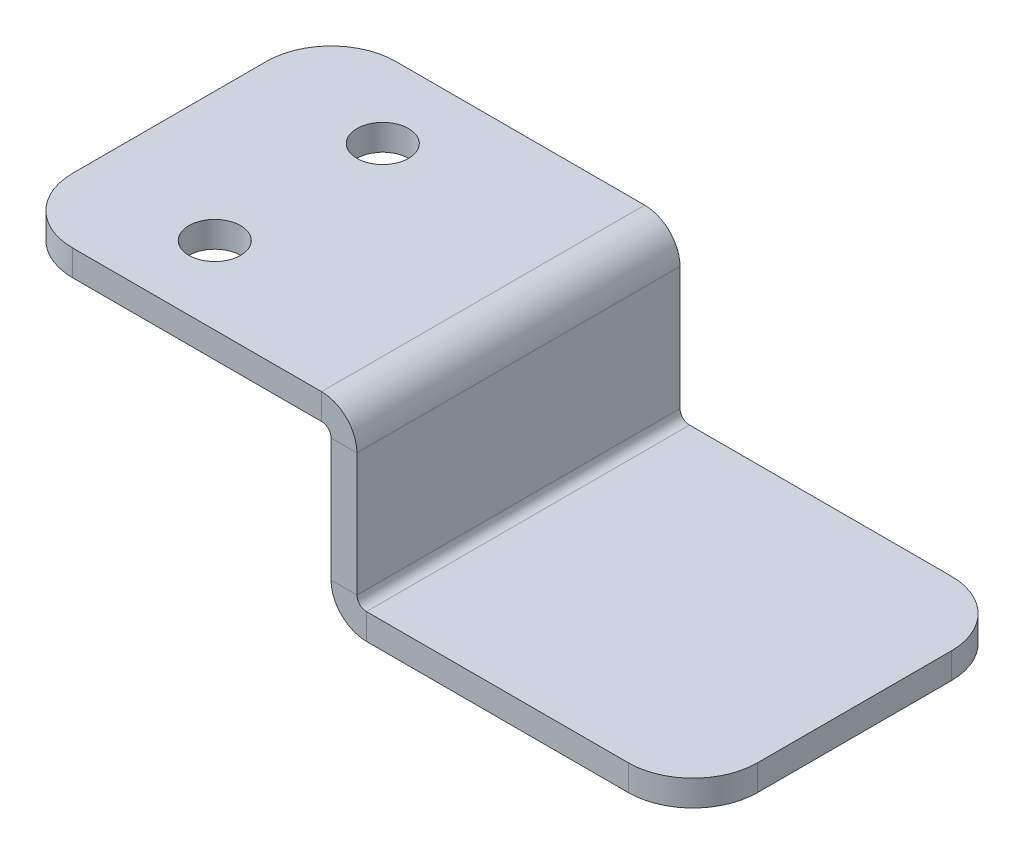
ISO-10303-21;
HEADER;
FILE_DESCRIPTION(('STEP AP214'),'2;1');
FILE_NAME('part.step','',(''),(''),'','','');
FILE_SCHEMA(('AUTOMOTIVE_DESIGN { 1 0 10303 214 1 1 1 1 }'));
ENDSEC;
DATA;
#1=APPLICATION_CONTEXT('core data for automotive mechanical design processes');
#2=APPLICATION_PROTOCOL_DEFINITION('international standard','automotive_design',2000,#1);
#3=PRODUCT_CONTEXT('',#1,'mechanical');
#4=PRODUCT('Part','Part','',(#3));
#5=PRODUCT_RELATED_PRODUCT_CATEGORY('part','',(#4));
#6=PRODUCT_DEFINITION_FORMATION('','',#4);
#7=PRODUCT_DEFINITION_CONTEXT('part definition',#1,'design');
#8=PRODUCT_DEFINITION('design','',#6,#7);
#9=PRODUCT_DEFINITION_SHAPE('','',#8);
#10=(LENGTH_UNIT() NAMED_UNIT(*) SI_UNIT(.MILLI.,.METRE.));
#11=(NAMED_UNIT(*) PLANE_ANGLE_UNIT() SI_UNIT($,.RADIAN.));
#12=(NAMED_UNIT(*) SI_UNIT($,.STERADIAN.) SOLID_ANGLE_UNIT());
#13=UNCERTAINTY_MEASURE_WITH_UNIT(LENGTH_MEASURE(1.E-05),#10,'distance_accuracy_value','');
#14=(GEOMETRIC_REPRESENTATION_CONTEXT(3) GLOBAL_UNCERTAINTY_ASSIGNED_CONTEXT((#13)) GLOBAL_UNIT_ASSIGNED_CONTEXT((#10,
#11,#12)) REPRESENTATION_CONTEXT('',''));
#15=CARTESIAN_POINT('',(0.,0.,0.));
#16=DIRECTION('',(0.,0.,1.));
#17=DIRECTION('',(1.,0.,0.));
#18=AXIS2_PLACEMENT_3D('',#15,#16,#17);
#19=CARTESIAN_POINT('',(25.,-10.2634,12.5));
#20=DIRECTION('',(0.,0.,1.));
#21=DIRECTION('',(1.,0.,0.));
#22=AXIS2_PLACEMENT_3D('',#19,#20,#21);
#23=PLANE('',#22);
#24=DIRECTION('',(1.,0.,0.));
#25=VECTOR('',#24,1.);
#26=CARTESIAN_POINT('',(25.,-10.2634,12.5));
#27=LINE('',#26,#25);
#28=CARTESIAN_POINT('',(25.,-10.2634,12.5));
#29=VERTEX_POINT('',#28);
#30=CARTESIAN_POINT('',(27.,-10.2634,12.5));
#31=VERTEX_POINT('',#30);
#32=EDGE_CURVE('E273',#29,#31,#27,.T.);
#33=ORIENTED_EDGE('',*,*,#32,.F.);
#34=CARTESIAN_POINT('',(27.7366,-10.2634,12.5));
#35=DIRECTION('',(0.,0.,1.));
#36=DIRECTION('',(1.,0.,0.));
#37=AXIS2_PLACEMENT_3D('',#34,#35,#36);
#38=CIRCLE('',#37,2.7366);
#39=CARTESIAN_POINT('',(27.7366,-13.,12.5));
#40=VERTEX_POINT('',#39);
#41=EDGE_CURVE('E191',#40,#29,#38,.F.);
#42=ORIENTED_EDGE('',*,*,#41,.F.);
#43=DIRECTION('',(0.,-1.,0.));
#44=VECTOR('',#43,1.);
#45=CARTESIAN_POINT('',(27.7366,-11.,12.5));
#46=LINE('',#45,#44);
#47=CARTESIAN_POINT('',(27.7366,-11.,12.5));
#48=VERTEX_POINT('',#47);
#49=EDGE_CURVE('E270',#48,#40,#46,.T.);
#50=ORIENTED_EDGE('',*,*,#49,.F.);
#51=CARTESIAN_POINT('',(27.7366,-10.2634,12.5));
#52=DIRECTION('',(0.,0.,1.));
#53=DIRECTION('',(1.,0.,0.));
#54=AXIS2_PLACEMENT_3D('',#51,#52,#53);
#55=CIRCLE('',#54,0.7366);
#56=EDGE_CURVE('E201',#48,#31,#55,.F.);
#57=ORIENTED_EDGE('',*,*,#56,.T.);
#58=EDGE_LOOP('',(#33,#42,#50,#57));
#59=FACE_BOUND('',#58,.T.);
#60=ADVANCED_FACE('F39',(#59),#23,.T.);
#61=CARTESIAN_POINT('',(27.7366,-11.,12.5));
#62=DIRECTION('',(0.,0.,1.));
#63=DIRECTION('',(1.,0.,0.));
#64=AXIS2_PLACEMENT_3D('',#61,#62,#63);
#65=PLANE('',#64);
#66=DIRECTION('',(0.,1.,0.));
#67=VECTOR('',#66,1.);
#68=CARTESIAN_POINT('',(25.,-13.,12.5));
#69=LINE('',#68,#67);
#70=CARTESIAN_POINT('',(25.,-0.736600000000007,12.5));
#71=VERTEX_POINT('',#70);
#72=EDGE_CURVE('E189',#29,#71,#69,.T.);
#73=ORIENTED_EDGE('',*,*,#72,.F.);
#74=ORIENTED_EDGE('',*,*,#32,.T.);
#75=DIRECTION('',(0.,1.,0.));
#76=VECTOR('',#75,1.);
#77=CARTESIAN_POINT('',(27.,-13.,12.5));
#78=LINE('',#77,#76);
#79=CARTESIAN_POINT('',(27.,-0.736600000000026,12.5));
#80=VERTEX_POINT('',#79);
#81=EDGE_CURVE('E204',#31,#80,#78,.T.);
#82=ORIENTED_EDGE('',*,*,#81,.T.);
#83=DIRECTION('',(-1.,0.,0.));
#84=VECTOR('',#83,1.);
#85=CARTESIAN_POINT('',(27.,-0.736600000000026,12.5));
#86=LINE('',#85,#84);
#87=EDGE_CURVE('E166',#80,#71,#86,.T.);
#88=ORIENTED_EDGE('',*,*,#87,.T.);
#89=EDGE_LOOP('',(#73,#74,#82,#88));
#90=FACE_BOUND('',#89,.T.);
#91=ADVANCED_FACE('F352',(#90),#65,.T.);
#92=CARTESIAN_POINT('',(27.7366,-13.,-12.5));
#93=DIRECTION('',(0.,0.,-1.));
#94=DIRECTION('',(-1.,0.,0.));
#95=AXIS2_PLACEMENT_3D('',#92,#93,#94);
#96=PLANE('',#95);
#97=DIRECTION('',(0.,1.,0.));
#98=VECTOR('',#97,1.);
#99=CARTESIAN_POINT('',(27.7366,-13.,-12.5));
#100=LINE('',#99,#98);
#101=CARTESIAN_POINT('',(27.7366,-13.,-12.5));
#102=VERTEX_POINT('',#101);
#103=CARTESIAN_POINT('',(27.7366,-11.,-12.5));
#104=VERTEX_POINT('',#103);
#105=EDGE_CURVE('E267',#102,#104,#100,.T.);
#106=ORIENTED_EDGE('',*,*,#105,.F.);
#107=CARTESIAN_POINT('',(27.7366,-10.2634,-12.5));
#108=DIRECTION('',(0.,0.,1.));
#109=DIRECTION('',(1.,0.,0.));
#110=AXIS2_PLACEMENT_3D('',#107,#108,#109);
#111=CIRCLE('',#110,2.7366);
#112=CARTESIAN_POINT('',(25.,-10.2634,-12.5));
#113=VERTEX_POINT('',#112);
#114=EDGE_CURVE('E218',#102,#113,#111,.F.);
#115=ORIENTED_EDGE('',*,*,#114,.T.);
#116=DIRECTION('',(-1.,0.,0.));
#117=VECTOR('',#116,1.);
#118=CARTESIAN_POINT('',(27.,-10.2634,-12.5));
#119=LINE('',#118,#117);
#120=CARTESIAN_POINT('',(27.,-10.2634,-12.5));
#121=VERTEX_POINT('',#120);
#122=EDGE_CURVE('E165',#121,#113,#119,.T.);
#123=ORIENTED_EDGE('',*,*,#122,.F.);
#124=CARTESIAN_POINT('',(27.7366,-10.2634,-12.5));
#125=DIRECTION('',(0.,0.,1.));
#126=DIRECTION('',(1.,0.,0.));
#127=AXIS2_PLACEMENT_3D('',#124,#125,#126);
#128=CIRCLE('',#127,0.7366);
#129=EDGE_CURVE('E225',#104,#121,#128,.F.);
#130=ORIENTED_EDGE('',*,*,#129,.F.);
#131=EDGE_LOOP('',(#106,#115,#123,#130));
#132=FACE_BOUND('',#131,.T.);
#133=ADVANCED_FACE('F367',(#132),#96,.T.);
#134=CARTESIAN_POINT('',(27.,-10.2634,-12.5));
#135=DIRECTION('',(0.,0.,-1.));
#136=DIRECTION('',(-1.,0.,0.));
#137=AXIS2_PLACEMENT_3D('',#134,#135,#136);
#138=PLANE('',#137);
#139=DIRECTION('',(-1.,0.,0.));
#140=VECTOR('',#139,1.);
#141=CARTESIAN_POINT('',(53.,-11.,-12.5));
#142=LINE('',#141,#140);
#143=CARTESIAN_POINT('',(48.,-11.,-12.5));
#144=VERTEX_POINT('',#143);
#145=EDGE_CURVE('E223',#144,#104,#142,.T.);
#146=ORIENTED_EDGE('',*,*,#145,.F.);
#147=DIRECTION('',(0.,-1.,0.));
#148=VECTOR('',#147,1.);
#149=CARTESIAN_POINT('',(48.,-10.2634,-12.5));
#150=LINE('',#149,#148);
#151=CARTESIAN_POINT('',(48.,-13.,-12.5));
#152=VERTEX_POINT('',#151);
#153=EDGE_CURVE('E275',#144,#152,#150,.T.);
#154=ORIENTED_EDGE('',*,*,#153,.T.);
#155=DIRECTION('',(-1.,0.,0.));
#156=VECTOR('',#155,1.);
#157=CARTESIAN_POINT('',(53.,-13.,-12.5));
#158=LINE('',#157,#156);
#159=EDGE_CURVE('E221',#152,#102,#158,.T.);
#160=ORIENTED_EDGE('',*,*,#159,.T.);
#161=ORIENTED_EDGE('',*,*,#105,.T.);
#162=EDGE_LOOP('',(#146,#154,#160,#161));
#163=FACE_BOUND('',#162,.T.);
#164=ADVANCED_FACE('F393',(#163),#138,.T.);
#165=CARTESIAN_POINT('',(24.2634,0.,12.5));
#166=DIRECTION('',(0.,0.,1.));
#167=DIRECTION('',(1.,0.,0.));
#168=AXIS2_PLACEMENT_3D('',#165,#166,#167);
#169=PLANE('',#168);
#170=DIRECTION('',(0.,1.,0.));
#171=VECTOR('',#170,1.);
#172=CARTESIAN_POINT('',(24.2634,0.,12.5));
#173=LINE('',#172,#171);
#174=CARTESIAN_POINT('',(24.2634,0.,12.5));
#175=VERTEX_POINT('',#174);
#176=CARTESIAN_POINT('',(24.2634,2.,12.5));
#177=VERTEX_POINT('',#176);
#178=EDGE_CURVE('E156',#175,#177,#173,.T.);
#179=ORIENTED_EDGE('',*,*,#178,.F.);
#180=CARTESIAN_POINT('',(24.2634,-0.736600000000001,12.5));
#181=DIRECTION('',(0.,0.,-1.));
#182=DIRECTION('',(-1.,0.,0.));
#183=AXIS2_PLACEMENT_3D('',#180,#181,#182);
#184=CIRCLE('',#183,0.7366);
#185=EDGE_CURVE('E160',#71,#175,#184,.F.);
#186=ORIENTED_EDGE('',*,*,#185,.F.);
#187=ORIENTED_EDGE('',*,*,#87,.F.);
#188=CARTESIAN_POINT('',(24.2634,-0.736600000000001,12.5));
#189=DIRECTION('',(0.,0.,1.));
#190=DIRECTION('',(1.,0.,0.));
#191=AXIS2_PLACEMENT_3D('',#188,#189,#190);
#192=CIRCLE('',#191,2.7366);
#193=EDGE_CURVE('E163',#80,#177,#192,.T.);
#194=ORIENTED_EDGE('',*,*,#193,.T.);
#195=EDGE_LOOP('',(#179,#186,#187,#194));
#196=FACE_BOUND('',#195,.T.);
#197=ADVANCED_FACE('F158',(#196),#169,.T.);
#198=CARTESIAN_POINT('',(27.,-0.736600000000026,12.5));
#199=DIRECTION('',(0.,0.,1.));
#200=DIRECTION('',(1.,0.,0.));
#201=AXIS2_PLACEMENT_3D('',#198,#199,#200);
#202=PLANE('',#201);
#203=DIRECTION('',(-1.,0.,0.));
#204=VECTOR('',#203,1.);
#205=CARTESIAN_POINT('',(25.,2.,12.5));
#206=LINE('',#205,#204);
#207=CARTESIAN_POINT('',(5.,2.,12.5));
#208=VERTEX_POINT('',#207);
#209=EDGE_CURVE('E184',#177,#208,#206,.T.);
#210=ORIENTED_EDGE('',*,*,#209,.T.);
#211=DIRECTION('',(0.,1.,0.));
#212=VECTOR('',#211,1.);
#213=CARTESIAN_POINT('',(5.,-0.736600000000026,12.5));
#214=LINE('',#213,#212);
#215=CARTESIAN_POINT('',(5.,0.,12.5));
#216=VERTEX_POINT('',#215);
#217=EDGE_CURVE('E11',#208,#216,#214,.F.);
#218=ORIENTED_EDGE('',*,*,#217,.T.);
#219=DIRECTION('',(-1.,0.,0.));
#220=VECTOR('',#219,1.);
#221=CARTESIAN_POINT('',(25.,0.,12.5));
#222=LINE('',#221,#220);
#223=EDGE_CURVE('E173',#175,#216,#222,.T.);
#224=ORIENTED_EDGE('',*,*,#223,.F.);
#225=ORIENTED_EDGE('',*,*,#178,.T.);
#226=EDGE_LOOP('',(#210,#218,#224,#225));
#227=FACE_BOUND('',#226,.T.);
#228=ADVANCED_FACE('F183',(#227),#202,.T.);
#229=CARTESIAN_POINT('',(25.,-0.736600000000007,-12.5));
#230=DIRECTION('',(0.,0.,-1.));
#231=DIRECTION('',(-1.,0.,0.));
#232=AXIS2_PLACEMENT_3D('',#229,#230,#231);
#233=PLANE('',#232);
#234=DIRECTION('',(1.,0.,0.));
#235=VECTOR('',#234,1.);
#236=CARTESIAN_POINT('',(25.,-0.736600000000007,-12.5));
#237=LINE('',#236,#235);
#238=CARTESIAN_POINT('',(25.,-0.736600000000007,-12.5));
#239=VERTEX_POINT('',#238);
#240=CARTESIAN_POINT('',(27.,-0.736600000000026,-12.5));
#241=VERTEX_POINT('',#240);
#242=EDGE_CURVE('E263',#239,#241,#237,.T.);
#243=ORIENTED_EDGE('',*,*,#242,.F.);
#244=CARTESIAN_POINT('',(24.2634,-0.736600000000001,-12.5));
#245=DIRECTION('',(0.,0.,-1.));
#246=DIRECTION('',(-1.,0.,0.));
#247=AXIS2_PLACEMENT_3D('',#244,#245,#246);
#248=CIRCLE('',#247,0.7366);
#249=CARTESIAN_POINT('',(24.2634,0.,-12.5));
#250=VERTEX_POINT('',#249);
#251=EDGE_CURVE('E213',#239,#250,#248,.F.);
#252=ORIENTED_EDGE('',*,*,#251,.T.);
#253=DIRECTION('',(0.,-1.,0.));
#254=VECTOR('',#253,1.);
#255=CARTESIAN_POINT('',(24.2634,2.,-12.5));
#256=LINE('',#255,#254);
#257=CARTESIAN_POINT('',(24.2634,2.,-12.5));
#258=VERTEX_POINT('',#257);
#259=EDGE_CURVE('E261',#258,#250,#256,.T.);
#260=ORIENTED_EDGE('',*,*,#259,.F.);
#261=CARTESIAN_POINT('',(24.2634,-0.736600000000001,-12.5));
#262=DIRECTION('',(0.,0.,1.));
#263=DIRECTION('',(1.,0.,0.));
#264=AXIS2_PLACEMENT_3D('',#261,#262,#263);
#265=CIRCLE('',#264,2.7366);
#266=EDGE_CURVE('E231',#241,#258,#265,.T.);
#267=ORIENTED_EDGE('',*,*,#266,.F.);
#268=EDGE_LOOP('',(#243,#252,#260,#267));
#269=FACE_BOUND('',#268,.T.);
#270=ADVANCED_FACE('F335',(#269),#233,.T.);
#271=CARTESIAN_POINT('',(24.2634,2.,-12.5));
#272=DIRECTION('',(0.,0.,-1.));
#273=DIRECTION('',(-1.,0.,0.));
#274=AXIS2_PLACEMENT_3D('',#271,#272,#273);
#275=PLANE('',#274);
#276=DIRECTION('',(0.,1.,0.));
#277=VECTOR('',#276,1.);
#278=CARTESIAN_POINT('',(25.,-13.,-12.5));
#279=LINE('',#278,#277);
#280=EDGE_CURVE('E215',#113,#239,#279,.T.);
#281=ORIENTED_EDGE('',*,*,#280,.T.);
#282=ORIENTED_EDGE('',*,*,#242,.T.);
#283=DIRECTION('',(0.,1.,0.));
#284=VECTOR('',#283,1.);
#285=CARTESIAN_POINT('',(27.,-13.,-12.5));
#286=LINE('',#285,#284);
#287=EDGE_CURVE('E228',#121,#241,#286,.T.);
#288=ORIENTED_EDGE('',*,*,#287,.F.);
#289=ORIENTED_EDGE('',*,*,#122,.T.);
#290=EDGE_LOOP('',(#281,#282,#288,#289));
#291=FACE_BOUND('',#290,.T.);
#292=ADVANCED_FACE('F345',(#291),#275,.T.);
#293=CARTESIAN_POINT('',(25.,2.,12.5));
#294=DIRECTION('',(0.,-1.,0.));
#295=DIRECTION('',(1.,0.,0.));
#296=AXIS2_PLACEMENT_3D('',#293,#294,#295);
#297=PLANE('',#296);
#298=CARTESIAN_POINT('',(10.,2.,-6.5));
#299=DIRECTION('',(0.,1.,0.));
#300=DIRECTION('',(-1.,0.,0.));
#301=AXIS2_PLACEMENT_3D('',#298,#299,#300);
#302=CIRCLE('',#301,2.);
#303=CARTESIAN_POINT('',(8.,2.,-6.5));
#304=VERTEX_POINT('',#303);
#305=EDGE_CURVE('E308',#304,#304,#302,.T.);
#306=ORIENTED_EDGE('',*,*,#305,.F.);
#307=EDGE_LOOP('',(#306));
#308=FACE_BOUND('',#307,.T.);
#309=CARTESIAN_POINT('',(10.,2.,6.5));
#310=DIRECTION('',(0.,1.,0.));
#311=DIRECTION('',(1.,0.,0.));
#312=AXIS2_PLACEMENT_3D('',#309,#310,#311);
#313=CIRCLE('',#312,2.);
#314=CARTESIAN_POINT('',(12.,2.,6.5));
#315=VERTEX_POINT('',#314);
#316=EDGE_CURVE('E313',#315,#315,#313,.T.);
#317=ORIENTED_EDGE('',*,*,#316,.F.);
#318=EDGE_LOOP('',(#317));
#319=FACE_BOUND('',#318,.T.);
#320=DIRECTION('',(-1.,0.,0.));
#321=VECTOR('',#320,1.);
#322=CARTESIAN_POINT('',(25.,2.,-12.5));
#323=LINE('',#322,#321);
#324=CARTESIAN_POINT('',(5.,2.,-12.5));
#325=VERTEX_POINT('',#324);
#326=EDGE_CURVE('E209',#258,#325,#323,.T.);
#327=ORIENTED_EDGE('',*,*,#326,.T.);
#328=CARTESIAN_POINT('',(5.,2.,-7.5));
#329=DIRECTION('',(0.,-1.,0.));
#330=DIRECTION('',(1.,0.,0.));
#331=AXIS2_PLACEMENT_3D('',#328,#329,#330);
#332=CIRCLE('',#331,5.);
#333=CARTESIAN_POINT('',(0.,2.,-7.5));
#334=VERTEX_POINT('',#333);
#335=EDGE_CURVE('E298',#325,#334,#332,.F.);
#336=ORIENTED_EDGE('',*,*,#335,.T.);
#337=DIRECTION('',(0.,0.,-1.));
#338=VECTOR('',#337,1.);
#339=CARTESIAN_POINT('',(0.,2.,12.5));
#340=LINE('',#339,#338);
#341=CARTESIAN_POINT('',(0.,2.,7.5));
#342=VERTEX_POINT('',#341);
#343=EDGE_CURVE('E259',#342,#334,#340,.T.);
#344=ORIENTED_EDGE('',*,*,#343,.F.);
#345=CARTESIAN_POINT('',(5.,2.,7.5));
#346=DIRECTION('',(0.,-1.,0.));
#347=DIRECTION('',(1.,0.,0.));
#348=AXIS2_PLACEMENT_3D('',#345,#346,#347);
#349=CIRCLE('',#348,5.);
#350=EDGE_CURVE('E296',#342,#208,#349,.F.);
#351=ORIENTED_EDGE('',*,*,#350,.T.);
#352=ORIENTED_EDGE('',*,*,#209,.F.);
#353=DIRECTION('',(0.,0.,-1.));
#354=VECTOR('',#353,1.);
#355=CARTESIAN_POINT('',(24.2634,2.,12.5));
#356=LINE('',#355,#354);
#357=EDGE_CURVE('E208',#177,#258,#356,.T.);
#358=ORIENTED_EDGE('',*,*,#357,.T.);
#359=EDGE_LOOP('',(#327,#336,#344,#351,#352,#358));
#360=FACE_BOUND('',#359,.T.);
#361=ADVANCED_FACE('F326',(#308,#319,#360),#297,.F.);
#362=CARTESIAN_POINT('',(0.,0.,12.5));
#363=DIRECTION('',(-1.,0.,0.));
#364=DIRECTION('',(0.,0.,1.));
#365=AXIS2_PLACEMENT_3D('',#362,#363,#364);
#366=PLANE('',#365);
#367=ORIENTED_EDGE('',*,*,#343,.T.);
#368=DIRECTION('',(0.,1.,0.));
#369=VECTOR('',#368,1.);
#370=CARTESIAN_POINT('',(0.,0.,-7.5));
#371=LINE('',#370,#369);
#372=CARTESIAN_POINT('',(0.,0.,-7.5));
#373=VERTEX_POINT('',#372);
#374=EDGE_CURVE('E62',#334,#373,#371,.F.);
#375=ORIENTED_EDGE('',*,*,#374,.T.);
#376=DIRECTION('',(0.,0.,-1.));
#377=VECTOR('',#376,1.);
#378=CARTESIAN_POINT('',(0.,0.,12.5));
#379=LINE('',#378,#377);
#380=CARTESIAN_POINT('',(0.,0.,7.5));
#381=VERTEX_POINT('',#380);
#382=EDGE_CURVE('E180',#381,#373,#379,.T.);
#383=ORIENTED_EDGE('',*,*,#382,.F.);
#384=DIRECTION('',(0.,1.,0.));
#385=VECTOR('',#384,1.);
#386=CARTESIAN_POINT('',(0.,0.,7.5));
#387=LINE('',#386,#385);
#388=EDGE_CURVE('E300',#381,#342,#387,.T.);
#389=ORIENTED_EDGE('',*,*,#388,.T.);
#390=EDGE_LOOP('',(#367,#375,#383,#389));
#391=FACE_BOUND('',#390,.T.);
#392=ADVANCED_FACE('F324',(#391),#366,.T.);
#393=CARTESIAN_POINT('',(25.,0.,12.5));
#394=DIRECTION('',(0.,-1.,0.));
#395=DIRECTION('',(1.,0.,0.));
#396=AXIS2_PLACEMENT_3D('',#393,#394,#395);
#397=PLANE('',#396);
#398=CARTESIAN_POINT('',(10.,0.,-6.5));
#399=DIRECTION('',(0.,-1.,0.));
#400=DIRECTION('',(1.,0.,0.));
#401=AXIS2_PLACEMENT_3D('',#398,#399,#400);
#402=CIRCLE('',#401,2.);
#403=CARTESIAN_POINT('',(12.,0.,-6.5));
#404=VERTEX_POINT('',#403);
#405=EDGE_CURVE('E43',#404,#404,#402,.T.);
#406=ORIENTED_EDGE('',*,*,#405,.F.);
#407=EDGE_LOOP('',(#406));
#408=FACE_BOUND('',#407,.T.);
#409=CARTESIAN_POINT('',(10.,0.,6.5));
#410=DIRECTION('',(0.,-1.,0.));
#411=DIRECTION('',(1.,0.,0.));
#412=AXIS2_PLACEMENT_3D('',#409,#410,#411);
#413=CIRCLE('',#412,2.);
#414=CARTESIAN_POINT('',(12.,0.,6.5));
#415=VERTEX_POINT('',#414);
#416=EDGE_CURVE('E306',#415,#415,#413,.T.);
#417=ORIENTED_EDGE('',*,*,#416,.F.);
#418=EDGE_LOOP('',(#417));
#419=FACE_BOUND('',#418,.T.);
#420=ORIENTED_EDGE('',*,*,#382,.T.);
#421=CARTESIAN_POINT('',(5.,0.,-7.5));
#422=DIRECTION('',(0.,-1.,0.));
#423=DIRECTION('',(1.,0.,0.));
#424=AXIS2_PLACEMENT_3D('',#421,#422,#423);
#425=CIRCLE('',#424,5.);
#426=CARTESIAN_POINT('',(5.,0.,-12.5));
#427=VERTEX_POINT('',#426);
#428=EDGE_CURVE('E48',#373,#427,#425,.T.);
#429=ORIENTED_EDGE('',*,*,#428,.T.);
#430=DIRECTION('',(-1.,0.,0.));
#431=VECTOR('',#430,1.);
#432=CARTESIAN_POINT('',(25.,0.,-12.5));
#433=LINE('',#432,#431);
#434=EDGE_CURVE('E176',#250,#427,#433,.T.);
#435=ORIENTED_EDGE('',*,*,#434,.F.);
#436=DIRECTION('',(0.,0.,-1.));
#437=VECTOR('',#436,1.);
#438=CARTESIAN_POINT('',(24.2634,0.,12.5));
#439=LINE('',#438,#437);
#440=EDGE_CURVE('E171',#175,#250,#439,.T.);
#441=ORIENTED_EDGE('',*,*,#440,.F.);
#442=ORIENTED_EDGE('',*,*,#223,.T.);
#443=CARTESIAN_POINT('',(5.,0.,7.5));
#444=DIRECTION('',(0.,-1.,0.));
#445=DIRECTION('',(1.,0.,0.));
#446=AXIS2_PLACEMENT_3D('',#443,#444,#445);
#447=CIRCLE('',#446,5.);
#448=EDGE_CURVE('E304',#216,#381,#447,.T.);
#449=ORIENTED_EDGE('',*,*,#448,.T.);
#450=EDGE_LOOP('',(#420,#429,#435,#441,#442,#449));
#451=FACE_BOUND('',#450,.T.);
#452=ADVANCED_FACE('F172',(#408,#419,#451),#397,.T.);
#453=CARTESIAN_POINT('',(24.2634,-0.736600000000001,12.5));
#454=DIRECTION('',(0.,0.,-1.));
#455=DIRECTION('',(-1.,0.,0.));
#456=AXIS2_PLACEMENT_3D('',#453,#454,#455);
#457=CYLINDRICAL_SURFACE('',#456,0.7366);
#458=ORIENTED_EDGE('',*,*,#251,.F.);
#459=DIRECTION('',(0.,0.,-1.));
#460=VECTOR('',#459,1.);
#461=CARTESIAN_POINT('',(25.,-0.736600000000007,12.5));
#462=LINE('',#461,#460);
#463=EDGE_CURVE('E181',#71,#239,#462,.T.);
#464=ORIENTED_EDGE('',*,*,#463,.F.);
#465=ORIENTED_EDGE('',*,*,#185,.T.);
#466=ORIENTED_EDGE('',*,*,#440,.T.);
#467=EDGE_LOOP('',(#458,#464,#465,#466));
#468=FACE_BOUND('',#467,.T.);
#469=ADVANCED_FACE('F187',(#468),#457,.F.);
#470=CARTESIAN_POINT('',(25.,-13.,12.5));
#471=DIRECTION('',(-1.,0.,0.));
#472=DIRECTION('',(0.,0.,1.));
#473=AXIS2_PLACEMENT_3D('',#470,#471,#472);
#474=PLANE('',#473);
#475=ORIENTED_EDGE('',*,*,#280,.F.);
#476=DIRECTION('',(0.,0.,-1.));
#477=VECTOR('',#476,1.);
#478=CARTESIAN_POINT('',(25.,-10.2634,12.5));
#479=LINE('',#478,#477);
#480=EDGE_CURVE('E254',#29,#113,#479,.T.);
#481=ORIENTED_EDGE('',*,*,#480,.F.);
#482=ORIENTED_EDGE('',*,*,#72,.T.);
#483=ORIENTED_EDGE('',*,*,#463,.T.);
#484=EDGE_LOOP('',(#475,#481,#482,#483));
#485=FACE_BOUND('',#484,.T.);
#486=ADVANCED_FACE('F348',(#485),#474,.T.);
#487=CARTESIAN_POINT('',(27.7366,-10.2634,12.5));
#488=DIRECTION('',(0.,0.,-1.));
#489=DIRECTION('',(-1.,0.,0.));
#490=AXIS2_PLACEMENT_3D('',#487,#488,#489);
#491=CYLINDRICAL_SURFACE('',#490,2.7366);
#492=ORIENTED_EDGE('',*,*,#114,.F.);
#493=DIRECTION('',(0.,0.,-1.));
#494=VECTOR('',#493,1.);
#495=CARTESIAN_POINT('',(27.7366,-13.,12.5));
#496=LINE('',#495,#494);
#497=EDGE_CURVE('E251',#40,#102,#496,.T.);
#498=ORIENTED_EDGE('',*,*,#497,.F.);
#499=ORIENTED_EDGE('',*,*,#41,.T.);
#500=ORIENTED_EDGE('',*,*,#480,.T.);
#501=EDGE_LOOP('',(#492,#498,#499,#500));
#502=FACE_BOUND('',#501,.T.);
#503=ADVANCED_FACE('F357',(#502),#491,.T.);
#504=CARTESIAN_POINT('',(53.,-13.,12.5));
#505=DIRECTION('',(0.,-1.,0.));
#506=DIRECTION('',(1.,0.,0.));
#507=AXIS2_PLACEMENT_3D('',#504,#505,#506);
#508=PLANE('',#507);
#509=ORIENTED_EDGE('',*,*,#159,.F.);
#510=CARTESIAN_POINT('',(48.,-13.,-7.5));
#511=DIRECTION('',(0.,-1.,0.));
#512=DIRECTION('',(1.,0.,0.));
#513=AXIS2_PLACEMENT_3D('',#510,#511,#512);
#514=CIRCLE('',#513,5.);
#515=CARTESIAN_POINT('',(53.,-13.,-7.5));
#516=VERTEX_POINT('',#515);
#517=EDGE_CURVE('E280',#152,#516,#514,.T.);
#518=ORIENTED_EDGE('',*,*,#517,.T.);
#519=DIRECTION('',(0.,0.,-1.));
#520=VECTOR('',#519,1.);
#521=CARTESIAN_POINT('',(53.,-13.,12.5));
#522=LINE('',#521,#520);
#523=CARTESIAN_POINT('',(53.,-13.,7.5));
#524=VERTEX_POINT('',#523);
#525=EDGE_CURVE('E248',#524,#516,#522,.T.);
#526=ORIENTED_EDGE('',*,*,#525,.F.);
#527=CARTESIAN_POINT('',(48.,-13.,7.5));
#528=DIRECTION('',(0.,-1.,0.));
#529=DIRECTION('',(1.,0.,0.));
#530=AXIS2_PLACEMENT_3D('',#527,#528,#529);
#531=CIRCLE('',#530,5.);
#532=CARTESIAN_POINT('',(48.,-13.,12.5));
#533=VERTEX_POINT('',#532);
#534=EDGE_CURVE('E278',#524,#533,#531,.T.);
#535=ORIENTED_EDGE('',*,*,#534,.T.);
#536=DIRECTION('',(-1.,0.,0.));
#537=VECTOR('',#536,1.);
#538=CARTESIAN_POINT('',(53.,-13.,12.5));
#539=LINE('',#538,#537);
#540=EDGE_CURVE('E197',#533,#40,#539,.T.);
#541=ORIENTED_EDGE('',*,*,#540,.T.);
#542=ORIENTED_EDGE('',*,*,#497,.T.);
#543=EDGE_LOOP('',(#509,#518,#526,#535,#541,#542));
#544=FACE_BOUND('',#543,.T.);
#545=ADVANCED_FACE('F372',(#544),#508,.T.);
#546=CARTESIAN_POINT('',(53.,-11.,12.5));
#547=DIRECTION('',(1.,0.,0.));
#548=DIRECTION('',(0.,0.,-1.));
#549=AXIS2_PLACEMENT_3D('',#546,#547,#548);
#550=PLANE('',#549);
#551=ORIENTED_EDGE('',*,*,#525,.T.);
#552=DIRECTION('',(0.,-1.,0.));
#553=VECTOR('',#552,1.);
#554=CARTESIAN_POINT('',(53.,-11.,-7.5));
#555=LINE('',#554,#553);
#556=CARTESIAN_POINT('',(53.,-11.,-7.5));
#557=VERTEX_POINT('',#556);
#558=EDGE_CURVE('E285',#516,#557,#555,.F.);
#559=ORIENTED_EDGE('',*,*,#558,.T.);
#560=DIRECTION('',(0.,0.,-1.));
#561=VECTOR('',#560,1.);
#562=CARTESIAN_POINT('',(53.,-11.,12.5));
#563=LINE('',#562,#561);
#564=CARTESIAN_POINT('',(53.,-11.,7.5));
#565=VERTEX_POINT('',#564);
#566=EDGE_CURVE('E245',#565,#557,#563,.T.);
#567=ORIENTED_EDGE('',*,*,#566,.F.);
#568=DIRECTION('',(0.,-1.,0.));
#569=VECTOR('',#568,1.);
#570=CARTESIAN_POINT('',(53.,-13.,7.5));
#571=LINE('',#570,#569);
#572=EDGE_CURVE('E282',#565,#524,#571,.T.);
#573=ORIENTED_EDGE('',*,*,#572,.T.);
#574=EDGE_LOOP('',(#551,#559,#567,#573));
#575=FACE_BOUND('',#574,.T.);
#576=ADVANCED_FACE('F387',(#575),#550,.T.);
#577=CARTESIAN_POINT('',(53.,-11.,12.5));
#578=DIRECTION('',(0.,-1.,0.));
#579=DIRECTION('',(1.,0.,0.));
#580=AXIS2_PLACEMENT_3D('',#577,#578,#579);
#581=PLANE('',#580);
#582=ORIENTED_EDGE('',*,*,#566,.T.);
#583=CARTESIAN_POINT('',(48.,-11.,-7.5));
#584=DIRECTION('',(0.,-1.,0.));
#585=DIRECTION('',(1.,0.,0.));
#586=AXIS2_PLACEMENT_3D('',#583,#584,#585);
#587=CIRCLE('',#586,5.);
#588=EDGE_CURVE('E289',#557,#144,#587,.F.);
#589=ORIENTED_EDGE('',*,*,#588,.T.);
#590=ORIENTED_EDGE('',*,*,#145,.T.);
#591=DIRECTION('',(0.,0.,-1.));
#592=VECTOR('',#591,1.);
#593=CARTESIAN_POINT('',(27.7366,-11.,12.5));
#594=LINE('',#593,#592);
#595=EDGE_CURVE('E242',#48,#104,#594,.T.);
#596=ORIENTED_EDGE('',*,*,#595,.F.);
#597=DIRECTION('',(-1.,0.,0.));
#598=VECTOR('',#597,1.);
#599=CARTESIAN_POINT('',(53.,-11.,12.5));
#600=LINE('',#599,#598);
#601=CARTESIAN_POINT('',(48.,-11.,12.5));
#602=VERTEX_POINT('',#601);
#603=EDGE_CURVE('E199',#602,#48,#600,.T.);
#604=ORIENTED_EDGE('',*,*,#603,.F.);
#605=CARTESIAN_POINT('',(48.,-11.,7.5));
#606=DIRECTION('',(0.,-1.,0.));
#607=DIRECTION('',(1.,0.,0.));
#608=AXIS2_PLACEMENT_3D('',#605,#606,#607);
#609=CIRCLE('',#608,5.);
#610=EDGE_CURVE('E287',#602,#565,#609,.F.);
#611=ORIENTED_EDGE('',*,*,#610,.T.);
#612=EDGE_LOOP('',(#582,#589,#590,#596,#604,#611));
#613=FACE_BOUND('',#612,.T.);
#614=ADVANCED_FACE('F381',(#613),#581,.F.);
#615=CARTESIAN_POINT('',(27.7366,-10.2634,12.5));
#616=DIRECTION('',(0.,0.,-1.));
#617=DIRECTION('',(-1.,0.,0.));
#618=AXIS2_PLACEMENT_3D('',#615,#616,#617);
#619=CYLINDRICAL_SURFACE('',#618,0.7366);
#620=ORIENTED_EDGE('',*,*,#129,.T.);
#621=DIRECTION('',(0.,0.,-1.));
#622=VECTOR('',#621,1.);
#623=CARTESIAN_POINT('',(27.,-10.2634,12.5));
#624=LINE('',#623,#622);
#625=EDGE_CURVE('E239',#31,#121,#624,.T.);
#626=ORIENTED_EDGE('',*,*,#625,.F.);
#627=ORIENTED_EDGE('',*,*,#56,.F.);
#628=ORIENTED_EDGE('',*,*,#595,.T.);
#629=EDGE_LOOP('',(#620,#626,#627,#628));
#630=FACE_BOUND('',#629,.T.);
#631=ADVANCED_FACE('F363',(#630),#619,.F.);
#632=CARTESIAN_POINT('',(27.,-13.,12.5));
#633=DIRECTION('',(-1.,0.,0.));
#634=DIRECTION('',(0.,0.,1.));
#635=AXIS2_PLACEMENT_3D('',#632,#633,#634);
#636=PLANE('',#635);
#637=ORIENTED_EDGE('',*,*,#287,.T.);
#638=DIRECTION('',(0.,0.,-1.));
#639=VECTOR('',#638,1.);
#640=CARTESIAN_POINT('',(27.,-0.736600000000026,12.5));
#641=LINE('',#640,#639);
#642=EDGE_CURVE('E236',#80,#241,#641,.T.);
#643=ORIENTED_EDGE('',*,*,#642,.F.);
#644=ORIENTED_EDGE('',*,*,#81,.F.);
#645=ORIENTED_EDGE('',*,*,#625,.T.);
#646=EDGE_LOOP('',(#637,#643,#644,#645));
#647=FACE_BOUND('',#646,.T.);
#648=ADVANCED_FACE('F341',(#647),#636,.F.);
#649=CARTESIAN_POINT('',(24.2634,-0.736600000000001,12.5));
#650=DIRECTION('',(0.,0.,-1.));
#651=DIRECTION('',(-1.,0.,0.));
#652=AXIS2_PLACEMENT_3D('',#649,#650,#651);
#653=CYLINDRICAL_SURFACE('',#652,2.7366);
#654=ORIENTED_EDGE('',*,*,#266,.T.);
#655=ORIENTED_EDGE('',*,*,#357,.F.);
#656=ORIENTED_EDGE('',*,*,#193,.F.);
#657=ORIENTED_EDGE('',*,*,#642,.T.);
#658=EDGE_LOOP('',(#654,#655,#656,#657));
#659=FACE_BOUND('',#658,.T.);
#660=ADVANCED_FACE('F337',(#659),#653,.T.);
#661=CARTESIAN_POINT('',(24.2634,-0.736600000000001,12.5));
#662=DIRECTION('',(0.,0.,-1.));
#663=DIRECTION('',(-1.,0.,0.));
#664=AXIS2_PLACEMENT_3D('',#661,#662,#663);
#665=PLANE('',#664);
#666=ORIENTED_EDGE('',*,*,#540,.F.);
#667=DIRECTION('',(0.,-1.,0.));
#668=VECTOR('',#667,1.);
#669=CARTESIAN_POINT('',(48.,-11.,12.5));
#670=LINE('',#669,#668);
#671=EDGE_CURVE('E291',#533,#602,#670,.F.);
#672=ORIENTED_EDGE('',*,*,#671,.T.);
#673=ORIENTED_EDGE('',*,*,#603,.T.);
#674=ORIENTED_EDGE('',*,*,#49,.T.);
#675=EDGE_LOOP('',(#666,#672,#673,#674));
#676=FACE_BOUND('',#675,.T.);
#677=ADVANCED_FACE('F377',(#676),#665,.F.);
#678=CARTESIAN_POINT('',(24.2634,-0.736600000000001,-12.5));
#679=DIRECTION('',(0.,0.,-1.));
#680=DIRECTION('',(-1.,0.,0.));
#681=AXIS2_PLACEMENT_3D('',#678,#679,#680);
#682=PLANE('',#681);
#683=ORIENTED_EDGE('',*,*,#434,.T.);
#684=DIRECTION('',(0.,1.,0.));
#685=VECTOR('',#684,1.);
#686=CARTESIAN_POINT('',(5.,-0.736600000000001,-12.5));
#687=LINE('',#686,#685);
#688=EDGE_CURVE('E293',#427,#325,#687,.T.);
#689=ORIENTED_EDGE('',*,*,#688,.T.);
#690=ORIENTED_EDGE('',*,*,#326,.F.);
#691=ORIENTED_EDGE('',*,*,#259,.T.);
#692=EDGE_LOOP('',(#683,#689,#690,#691));
#693=FACE_BOUND('',#692,.T.);
#694=ADVANCED_FACE('F332',(#693),#682,.T.);
#695=CARTESIAN_POINT('',(48.,-10.2634,-7.5));
#696=DIRECTION('',(0.,-1.,0.));
#697=DIRECTION('',(0.,0.,-1.));
#698=AXIS2_PLACEMENT_3D('',#695,#696,#697);
#699=CYLINDRICAL_SURFACE('',#698,5.);
#700=ORIENTED_EDGE('',*,*,#588,.F.);
#701=ORIENTED_EDGE('',*,*,#558,.F.);
#702=ORIENTED_EDGE('',*,*,#517,.F.);
#703=ORIENTED_EDGE('',*,*,#153,.F.);
#704=EDGE_LOOP('',(#700,#701,#702,#703));
#705=FACE_BOUND('',#704,.T.);
#706=ADVANCED_FACE('F392',(#705),#699,.T.);
#707=CARTESIAN_POINT('',(48.,-11.,7.5));
#708=DIRECTION('',(0.,1.,0.));
#709=DIRECTION('',(0.,0.,1.));
#710=AXIS2_PLACEMENT_3D('',#707,#708,#709);
#711=CYLINDRICAL_SURFACE('',#710,5.);
#712=ORIENTED_EDGE('',*,*,#610,.F.);
#713=ORIENTED_EDGE('',*,*,#671,.F.);
#714=ORIENTED_EDGE('',*,*,#534,.F.);
#715=ORIENTED_EDGE('',*,*,#572,.F.);
#716=EDGE_LOOP('',(#712,#713,#714,#715));
#717=FACE_BOUND('',#716,.T.);
#718=ADVANCED_FACE('F385',(#717),#711,.T.);
#719=CARTESIAN_POINT('',(5.,-0.736600000000001,-7.5));
#720=DIRECTION('',(0.,1.,0.));
#721=DIRECTION('',(0.,0.,1.));
#722=AXIS2_PLACEMENT_3D('',#719,#720,#721);
#723=CYLINDRICAL_SURFACE('',#722,5.);
#724=ORIENTED_EDGE('',*,*,#428,.F.);
#725=ORIENTED_EDGE('',*,*,#374,.F.);
#726=ORIENTED_EDGE('',*,*,#335,.F.);
#727=ORIENTED_EDGE('',*,*,#688,.F.);
#728=EDGE_LOOP('',(#724,#725,#726,#727));
#729=FACE_BOUND('',#728,.T.);
#730=ADVANCED_FACE('F330',(#729),#723,.T.);
#731=CARTESIAN_POINT('',(5.,0.,7.5));
#732=DIRECTION('',(0.,1.,0.));
#733=DIRECTION('',(0.,0.,1.));
#734=AXIS2_PLACEMENT_3D('',#731,#732,#733);
#735=CYLINDRICAL_SURFACE('',#734,5.);
#736=ORIENTED_EDGE('',*,*,#448,.F.);
#737=ORIENTED_EDGE('',*,*,#217,.F.);
#738=ORIENTED_EDGE('',*,*,#350,.F.);
#739=ORIENTED_EDGE('',*,*,#388,.F.);
#740=EDGE_LOOP('',(#736,#737,#738,#739));
#741=FACE_BOUND('',#740,.T.);
#742=ADVANCED_FACE('F41',(#741),#735,.T.);
#743=CARTESIAN_POINT('',(10.,-8.,6.5));
#744=DIRECTION('',(0.,1.,0.));
#745=DIRECTION('',(-1.,0.,0.));
#746=AXIS2_PLACEMENT_3D('',#743,#744,#745);
#747=CYLINDRICAL_SURFACE('',#746,2.);
#748=ORIENTED_EDGE('',*,*,#416,.T.);
#749=EDGE_LOOP('',(#748));
#750=FACE_BOUND('',#749,.T.);
#751=ORIENTED_EDGE('',*,*,#316,.T.);
#752=EDGE_LOOP('',(#751));
#753=FACE_BOUND('',#752,.T.);
#754=ADVANCED_FACE('F416',(#750,#753),#747,.F.);
#755=CARTESIAN_POINT('',(10.,-8.,-6.5));
#756=DIRECTION('',(0.,1.,0.));
#757=DIRECTION('',(-1.,0.,0.));
#758=AXIS2_PLACEMENT_3D('',#755,#756,#757);
#759=CYLINDRICAL_SURFACE('',#758,2.);
#760=ORIENTED_EDGE('',*,*,#405,.T.);
#761=EDGE_LOOP('',(#760));
#762=FACE_BOUND('',#761,.T.);
#763=ORIENTED_EDGE('',*,*,#305,.T.);
#764=EDGE_LOOP('',(#763));
#765=FACE_BOUND('',#764,.T.);
#766=ADVANCED_FACE('F420',(#762,#765),#759,.F.);
#767=CLOSED_SHELL('',(#60,#91,#133,#164,#197,#228,#270,#292,#361,#392,#452,#469,#486,#503,#545,
#576,#614,#631,#648,#660,#677,#694,#706,#718,#730,#742,#754,#766));
#768=MANIFOLD_SOLID_BREP('B2',#767);
#769=ADVANCED_BREP_SHAPE_REPRESENTATION('',(#18,#768),#14);
#770=SHAPE_DEFINITION_REPRESENTATION(#9,#769);
ENDSEC;
END-ISO-10303-21;
